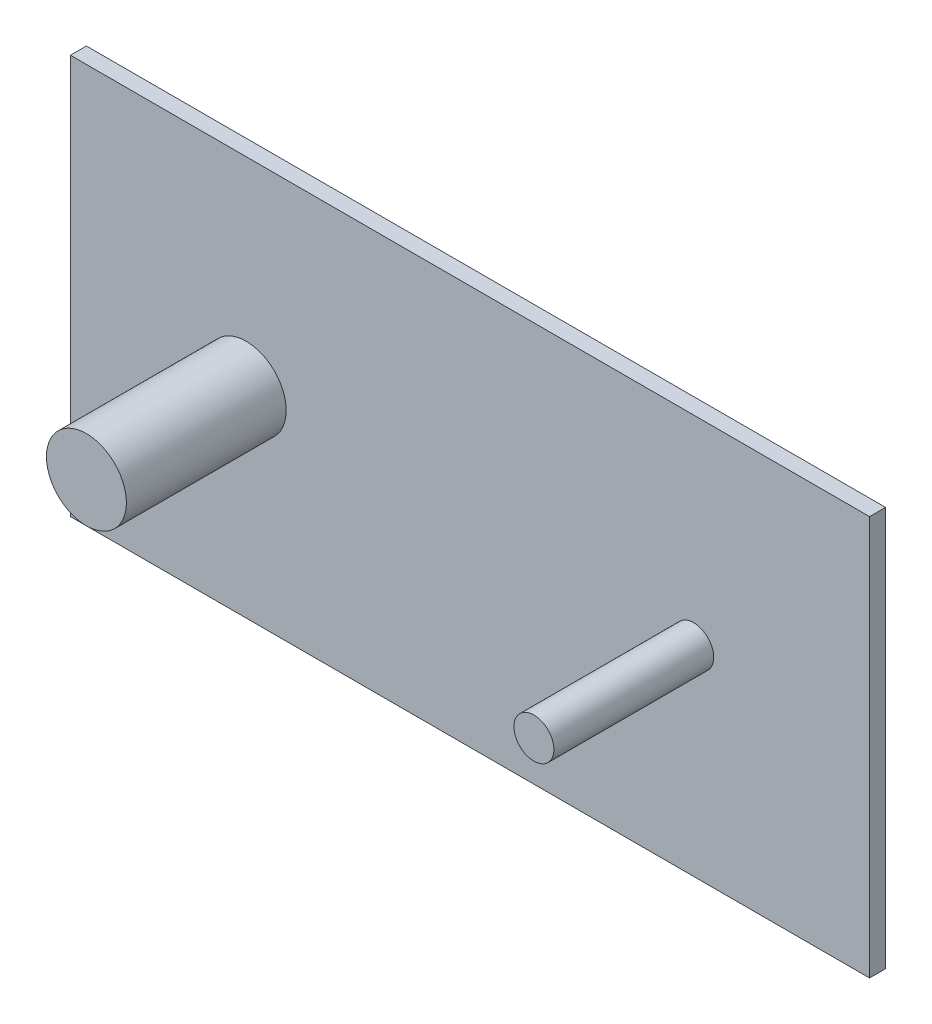
ISO-10303-21;
HEADER;
FILE_DESCRIPTION(('STEP AP214'),'2;1');
FILE_NAME('part.step','',(''),(''),'','','');
FILE_SCHEMA(('AUTOMOTIVE_DESIGN { 1 0 10303 214 1 1 1 1 }'));
ENDSEC;
DATA;
#1=APPLICATION_CONTEXT('core data for automotive mechanical design processes');
#2=APPLICATION_PROTOCOL_DEFINITION('international standard','automotive_design',2000,#1);
#3=PRODUCT_CONTEXT('',#1,'mechanical');
#4=PRODUCT('Part','Part','',(#3));
#5=PRODUCT_RELATED_PRODUCT_CATEGORY('part','',(#4));
#6=PRODUCT_DEFINITION_FORMATION('','',#4);
#7=PRODUCT_DEFINITION_CONTEXT('part definition',#1,'design');
#8=PRODUCT_DEFINITION('design','',#6,#7);
#9=PRODUCT_DEFINITION_SHAPE('','',#8);
#10=(LENGTH_UNIT() NAMED_UNIT(*) SI_UNIT(.MILLI.,.METRE.));
#11=(NAMED_UNIT(*) PLANE_ANGLE_UNIT() SI_UNIT($,.RADIAN.));
#12=(NAMED_UNIT(*) SI_UNIT($,.STERADIAN.) SOLID_ANGLE_UNIT());
#13=UNCERTAINTY_MEASURE_WITH_UNIT(LENGTH_MEASURE(1.E-05),#10,'distance_accuracy_value','');
#14=(GEOMETRIC_REPRESENTATION_CONTEXT(3) GLOBAL_UNCERTAINTY_ASSIGNED_CONTEXT((#13)) GLOBAL_UNIT_ASSIGNED_CONTEXT((#10,
#11,#12)) REPRESENTATION_CONTEXT('',''));
#15=CARTESIAN_POINT('',(0.,0.,0.));
#16=DIRECTION('',(0.,0.,1.));
#17=DIRECTION('',(1.,0.,0.));
#18=AXIS2_PLACEMENT_3D('',#15,#16,#17);
#19=CARTESIAN_POINT('',(250.,-125.,10.));
#20=DIRECTION('',(-1.,0.,0.));
#21=DIRECTION('',(0.,0.,1.));
#22=AXIS2_PLACEMENT_3D('',#19,#20,#21);
#23=PLANE('',#22);
#24=DIRECTION('',(0.,1.,0.));
#25=VECTOR('',#24,1.);
#26=CARTESIAN_POINT('',(250.,-125.,0.));
#27=LINE('',#26,#25);
#28=CARTESIAN_POINT('',(250.,-125.,0.));
#29=VERTEX_POINT('',#28);
#30=CARTESIAN_POINT('',(250.,125.,0.));
#31=VERTEX_POINT('',#30);
#32=EDGE_CURVE('E100',#29,#31,#27,.T.);
#33=ORIENTED_EDGE('',*,*,#32,.T.);
#34=DIRECTION('',(0.,0.,-1.));
#35=VECTOR('',#34,1.);
#36=CARTESIAN_POINT('',(250.,125.,10.));
#37=LINE('',#36,#35);
#38=CARTESIAN_POINT('',(250.,125.,10.));
#39=VERTEX_POINT('',#38);
#40=EDGE_CURVE('E91',#39,#31,#37,.T.);
#41=ORIENTED_EDGE('',*,*,#40,.F.);
#42=DIRECTION('',(0.,1.,0.));
#43=VECTOR('',#42,1.);
#44=CARTESIAN_POINT('',(250.,-125.,10.));
#45=LINE('',#44,#43);
#46=CARTESIAN_POINT('',(250.,-125.,10.));
#47=VERTEX_POINT('',#46);
#48=EDGE_CURVE('E85',#47,#39,#45,.T.);
#49=ORIENTED_EDGE('',*,*,#48,.F.);
#50=DIRECTION('',(0.,0.,-1.));
#51=VECTOR('',#50,1.);
#52=CARTESIAN_POINT('',(250.,-125.,10.));
#53=LINE('',#52,#51);
#54=EDGE_CURVE('E96',#47,#29,#53,.T.);
#55=ORIENTED_EDGE('',*,*,#54,.T.);
#56=EDGE_LOOP('',(#33,#41,#49,#55));
#57=FACE_BOUND('',#56,.T.);
#58=ADVANCED_FACE('F33',(#57),#23,.F.);
#59=CARTESIAN_POINT('',(-250.,125.,10.));
#60=DIRECTION('',(0.,-1.,0.));
#61=DIRECTION('',(0.,0.,-1.));
#62=AXIS2_PLACEMENT_3D('',#59,#60,#61);
#63=PLANE('',#62);
#64=DIRECTION('',(-1.,0.,0.));
#65=VECTOR('',#64,1.);
#66=CARTESIAN_POINT('',(-250.,125.,0.));
#67=LINE('',#66,#65);
#68=CARTESIAN_POINT('',(-250.,125.,0.));
#69=VERTEX_POINT('',#68);
#70=EDGE_CURVE('E90',#31,#69,#67,.T.);
#71=ORIENTED_EDGE('',*,*,#70,.T.);
#72=DIRECTION('',(0.,0.,-1.));
#73=VECTOR('',#72,1.);
#74=CARTESIAN_POINT('',(-250.,125.,10.));
#75=LINE('',#74,#73);
#76=CARTESIAN_POINT('',(-250.,125.,10.));
#77=VERTEX_POINT('',#76);
#78=EDGE_CURVE('E88',#77,#69,#75,.T.);
#79=ORIENTED_EDGE('',*,*,#78,.F.);
#80=DIRECTION('',(-1.,0.,0.));
#81=VECTOR('',#80,1.);
#82=CARTESIAN_POINT('',(-250.,125.,10.));
#83=LINE('',#82,#81);
#84=EDGE_CURVE('E80',#39,#77,#83,.T.);
#85=ORIENTED_EDGE('',*,*,#84,.F.);
#86=ORIENTED_EDGE('',*,*,#40,.T.);
#87=EDGE_LOOP('',(#71,#79,#85,#86));
#88=FACE_BOUND('',#87,.T.);
#89=ADVANCED_FACE('F89',(#88),#63,.F.);
#90=CARTESIAN_POINT('',(-250.,-125.,10.));
#91=DIRECTION('',(1.,0.,0.));
#92=DIRECTION('',(0.,0.,-1.));
#93=AXIS2_PLACEMENT_3D('',#90,#91,#92);
#94=PLANE('',#93);
#95=DIRECTION('',(0.,-1.,0.));
#96=VECTOR('',#95,1.);
#97=CARTESIAN_POINT('',(-250.,-125.,0.));
#98=LINE('',#97,#96);
#99=CARTESIAN_POINT('',(-250.,-125.,0.));
#100=VERTEX_POINT('',#99);
#101=EDGE_CURVE('E66',#69,#100,#98,.T.);
#102=ORIENTED_EDGE('',*,*,#101,.T.);
#103=DIRECTION('',(0.,0.,-1.));
#104=VECTOR('',#103,1.);
#105=CARTESIAN_POINT('',(-250.,-125.,10.));
#106=LINE('',#105,#104);
#107=CARTESIAN_POINT('',(-250.,-125.,10.));
#108=VERTEX_POINT('',#107);
#109=EDGE_CURVE('E92',#108,#100,#106,.T.);
#110=ORIENTED_EDGE('',*,*,#109,.F.);
#111=DIRECTION('',(0.,-1.,0.));
#112=VECTOR('',#111,1.);
#113=CARTESIAN_POINT('',(-250.,-125.,10.));
#114=LINE('',#113,#112);
#115=EDGE_CURVE('E83',#77,#108,#114,.T.);
#116=ORIENTED_EDGE('',*,*,#115,.F.);
#117=ORIENTED_EDGE('',*,*,#78,.T.);
#118=EDGE_LOOP('',(#102,#110,#116,#117));
#119=FACE_BOUND('',#118,.T.);
#120=ADVANCED_FACE('F94',(#119),#94,.F.);
#121=CARTESIAN_POINT('',(-250.,-125.,10.));
#122=DIRECTION('',(0.,1.,0.));
#123=DIRECTION('',(0.,0.,1.));
#124=AXIS2_PLACEMENT_3D('',#121,#122,#123);
#125=PLANE('',#124);
#126=DIRECTION('',(1.,0.,0.));
#127=VECTOR('',#126,1.);
#128=CARTESIAN_POINT('',(-250.,-125.,0.));
#129=LINE('',#128,#127);
#130=EDGE_CURVE('E72',#100,#29,#129,.T.);
#131=ORIENTED_EDGE('',*,*,#130,.T.);
#132=ORIENTED_EDGE('',*,*,#54,.F.);
#133=DIRECTION('',(1.,0.,0.));
#134=VECTOR('',#133,1.);
#135=CARTESIAN_POINT('',(-250.,-125.,10.));
#136=LINE('',#135,#134);
#137=EDGE_CURVE('E49',#108,#47,#136,.T.);
#138=ORIENTED_EDGE('',*,*,#137,.F.);
#139=ORIENTED_EDGE('',*,*,#109,.T.);
#140=EDGE_LOOP('',(#131,#132,#138,#139));
#141=FACE_BOUND('',#140,.T.);
#142=ADVANCED_FACE('F116',(#141),#125,.F.);
#143=CARTESIAN_POINT('',(0.,0.,10.));
#144=DIRECTION('',(0.,0.,-1.));
#145=DIRECTION('',(-1.,0.,0.));
#146=AXIS2_PLACEMENT_3D('',#143,#144,#145);
#147=PLANE('',#146);
#148=CARTESIAN_POINT('',(140.,0.,9.99999999999999));
#149=DIRECTION('',(0.,0.,-1.));
#150=DIRECTION('',(-1.,0.,0.));
#151=AXIS2_PLACEMENT_3D('',#148,#149,#150);
#152=CIRCLE('',#151,12.5);
#153=CARTESIAN_POINT('',(127.5,0.,9.99999999999999));
#154=VERTEX_POINT('',#153);
#155=EDGE_CURVE('E11',#154,#154,#152,.F.);
#156=ORIENTED_EDGE('',*,*,#155,.F.);
#157=EDGE_LOOP('',(#156));
#158=FACE_BOUND('',#157,.T.);
#159=CARTESIAN_POINT('',(-140.,0.,9.99999999999999));
#160=DIRECTION('',(0.,0.,-1.));
#161=DIRECTION('',(-1.,0.,0.));
#162=AXIS2_PLACEMENT_3D('',#159,#160,#161);
#163=CIRCLE('',#162,25.);
#164=CARTESIAN_POINT('',(-165.,0.,9.99999999999999));
#165=VERTEX_POINT('',#164);
#166=EDGE_CURVE('E41',#165,#165,#163,.F.);
#167=ORIENTED_EDGE('',*,*,#166,.F.);
#168=EDGE_LOOP('',(#167));
#169=FACE_BOUND('',#168,.T.);
#170=ORIENTED_EDGE('',*,*,#48,.T.);
#171=ORIENTED_EDGE('',*,*,#84,.T.);
#172=ORIENTED_EDGE('',*,*,#115,.T.);
#173=ORIENTED_EDGE('',*,*,#137,.T.);
#174=EDGE_LOOP('',(#170,#171,#172,#173));
#175=FACE_BOUND('',#174,.T.);
#176=ADVANCED_FACE('F81',(#158,#169,#175),#147,.F.);
#177=CARTESIAN_POINT('',(0.,0.,0.));
#178=DIRECTION('',(0.,0.,-1.));
#179=DIRECTION('',(-1.,0.,0.));
#180=AXIS2_PLACEMENT_3D('',#177,#178,#179);
#181=PLANE('',#180);
#182=ORIENTED_EDGE('',*,*,#32,.F.);
#183=ORIENTED_EDGE('',*,*,#130,.F.);
#184=ORIENTED_EDGE('',*,*,#101,.F.);
#185=ORIENTED_EDGE('',*,*,#70,.F.);
#186=EDGE_LOOP('',(#182,#183,#184,#185));
#187=FACE_BOUND('',#186,.T.);
#188=ADVANCED_FACE('F115',(#187),#181,.T.);
#189=CARTESIAN_POINT('',(-140.,0.,110.));
#190=DIRECTION('',(0.,0.,-1.));
#191=DIRECTION('',(-1.,0.,0.));
#192=AXIS2_PLACEMENT_3D('',#189,#190,#191);
#193=CYLINDRICAL_SURFACE('',#192,25.);
#194=CARTESIAN_POINT('',(-140.,0.,110.));
#195=DIRECTION('',(0.,0.,1.));
#196=DIRECTION('',(1.,0.,0.));
#197=AXIS2_PLACEMENT_3D('',#194,#195,#196);
#198=CIRCLE('',#197,25.);
#199=CARTESIAN_POINT('',(-165.,0.,110.));
#200=VERTEX_POINT('',#199);
#201=EDGE_CURVE('E103',#200,#200,#198,.T.);
#202=CARTESIAN_POINT('',(-165.,0.,110.));
#203=CARTESIAN_POINT('',(-165.,0.,108.958333333333));
#204=CARTESIAN_POINT('',(-165.,0.,107.916666666667));
#205=CARTESIAN_POINT('',(-165.,0.,105.833333333333));
#206=CARTESIAN_POINT('',(-165.,0.,104.791666666667));
#207=CARTESIAN_POINT('',(-165.,0.,102.708333333333));
#208=CARTESIAN_POINT('',(-165.,0.,101.666666666667));
#209=CARTESIAN_POINT('',(-165.,0.,99.5833333333333));
#210=CARTESIAN_POINT('',(-165.,0.,98.5416666666666));
#211=CARTESIAN_POINT('',(-165.,0.,96.4583333333333));
#212=CARTESIAN_POINT('',(-165.,0.,95.4166666666666));
#213=CARTESIAN_POINT('',(-165.,0.,93.3333333333333));
#214=CARTESIAN_POINT('',(-165.,0.,92.2916666666666));
#215=CARTESIAN_POINT('',(-165.,0.,90.2083333333333));
#216=CARTESIAN_POINT('',(-165.,0.,89.1666666666666));
#217=CARTESIAN_POINT('',(-165.,0.,87.0833333333333));
#218=CARTESIAN_POINT('',(-165.,0.,86.0416666666666));
#219=CARTESIAN_POINT('',(-165.,0.,83.9583333333333));
#220=CARTESIAN_POINT('',(-165.,0.,82.9166666666666));
#221=CARTESIAN_POINT('',(-165.,0.,80.8333333333333));
#222=CARTESIAN_POINT('',(-165.,0.,79.7916666666666));
#223=CARTESIAN_POINT('',(-165.,0.,77.7083333333333));
#224=CARTESIAN_POINT('',(-165.,0.,76.6666666666666));
#225=CARTESIAN_POINT('',(-165.,0.,74.5833333333333));
#226=CARTESIAN_POINT('',(-165.,0.,73.5416666666666));
#227=CARTESIAN_POINT('',(-165.,0.,71.4583333333333));
#228=CARTESIAN_POINT('',(-165.,0.,70.4166666666667));
#229=CARTESIAN_POINT('',(-165.,0.,68.3333333333333));
#230=CARTESIAN_POINT('',(-165.,0.,67.2916666666667));
#231=CARTESIAN_POINT('',(-165.,0.,65.2083333333333));
#232=CARTESIAN_POINT('',(-165.,0.,64.1666666666666));
#233=CARTESIAN_POINT('',(-165.,0.,62.0833333333333));
#234=CARTESIAN_POINT('',(-165.,0.,61.0416666666667));
#235=CARTESIAN_POINT('',(-165.,0.,58.9583333333333));
#236=CARTESIAN_POINT('',(-165.,0.,57.9166666666667));
#237=CARTESIAN_POINT('',(-165.,0.,55.8333333333333));
#238=CARTESIAN_POINT('',(-165.,0.,54.7916666666667));
#239=CARTESIAN_POINT('',(-165.,0.,52.7083333333333));
#240=CARTESIAN_POINT('',(-165.,0.,51.6666666666667));
#241=CARTESIAN_POINT('',(-165.,0.,49.5833333333333));
#242=CARTESIAN_POINT('',(-165.,0.,48.5416666666667));
#243=CARTESIAN_POINT('',(-165.,0.,46.4583333333333));
#244=CARTESIAN_POINT('',(-165.,0.,45.4166666666667));
#245=CARTESIAN_POINT('',(-165.,0.,43.3333333333333));
#246=CARTESIAN_POINT('',(-165.,0.,42.2916666666667));
#247=CARTESIAN_POINT('',(-165.,0.,40.2083333333333));
#248=CARTESIAN_POINT('',(-165.,0.,39.1666666666667));
#249=CARTESIAN_POINT('',(-165.,0.,37.0833333333333));
#250=CARTESIAN_POINT('',(-165.,0.,36.0416666666667));
#251=CARTESIAN_POINT('',(-165.,0.,33.9583333333333));
#252=CARTESIAN_POINT('',(-165.,0.,32.9166666666667));
#253=CARTESIAN_POINT('',(-165.,0.,30.8333333333333));
#254=CARTESIAN_POINT('',(-165.,0.,29.7916666666667));
#255=CARTESIAN_POINT('',(-165.,0.,27.7083333333333));
#256=CARTESIAN_POINT('',(-165.,0.,26.6666666666667));
#257=CARTESIAN_POINT('',(-165.,0.,24.5833333333333));
#258=CARTESIAN_POINT('',(-165.,0.,23.5416666666667));
#259=CARTESIAN_POINT('',(-165.,0.,21.4583333333333));
#260=CARTESIAN_POINT('',(-165.,0.,20.4166666666667));
#261=CARTESIAN_POINT('',(-165.,0.,18.3333333333333));
#262=CARTESIAN_POINT('',(-165.,0.,17.2916666666667));
#263=CARTESIAN_POINT('',(-165.,0.,15.2083333333333));
#264=CARTESIAN_POINT('',(-165.,0.,14.1666666666667));
#265=CARTESIAN_POINT('',(-165.,0.,12.0833333333333));
#266=CARTESIAN_POINT('',(-165.,0.,11.0416666666667));
#267=CARTESIAN_POINT('',(-165.,0.,9.99999999999999));
#268=B_SPLINE_CURVE_WITH_KNOTS('',3,(#202,#203,#204,#205,#206,#207,#208,#209,#210,#211,#212,
#213,#214,#215,#216,#217,#218,#219,#220,#221,#222,#223,#224,#225,#226,#227,#228,#229,#230,#231,
#232,#233,#234,#235,#236,#237,#238,#239,#240,#241,#242,#243,#244,#245,#246,#247,#248,#249,#250,
#251,#252,#253,#254,#255,#256,#257,#258,#259,#260,#261,#262,#263,#264,#265,#266,#267),
.UNSPECIFIED.,.F.,.F.,(4,2,2,2,2,2,2,2,2,2,2,2,2,2,2,2,2,2,2,2,2,2,2,2,2,2,2,2,2,2,2,2,4),(0.,
3.125,6.25000000000001,9.37500000000001,12.5,15.625,18.75,21.875,25.,28.125,31.25,34.375,37.5,
40.625,43.75,46.875,50.,53.125,56.25,59.375,62.5,65.625,68.75,71.875,75.,78.125,81.25,84.375,
87.5,90.625,93.75,96.875,100.),.UNSPECIFIED.);
#269=EDGE_CURVE('BSEAM112',#200,#165,#268,.T.);
#270=ORIENTED_EDGE('',*,*,#201,.F.);
#271=ORIENTED_EDGE('',*,*,#166,.T.);
#272=ORIENTED_EDGE('',*,*,#269,.T.);
#273=ORIENTED_EDGE('',*,*,#269,.F.);
#274=EDGE_LOOP('',(#270,#272,#271,#273));
#275=FACE_BOUND('',#274,.T.);
#276=ADVANCED_FACE('F112',(#275),#193,.T.);
#277=CARTESIAN_POINT('',(-140.,0.,110.));
#278=DIRECTION('',(0.,0.,1.));
#279=DIRECTION('',(1.,0.,0.));
#280=AXIS2_PLACEMENT_3D('',#277,#278,#279);
#281=PLANE('',#280);
#282=ORIENTED_EDGE('',*,*,#201,.T.);
#283=EDGE_LOOP('',(#282));
#284=FACE_BOUND('',#283,.T.);
#285=ADVANCED_FACE('F146',(#284),#281,.T.);
#286=CARTESIAN_POINT('',(140.,0.,110.));
#287=DIRECTION('',(0.,0.,-1.));
#288=DIRECTION('',(-1.,0.,0.));
#289=AXIS2_PLACEMENT_3D('',#286,#287,#288);
#290=CYLINDRICAL_SURFACE('',#289,12.5);
#291=CARTESIAN_POINT('',(140.,0.,110.));
#292=DIRECTION('',(0.,0.,1.));
#293=DIRECTION('',(1.,0.,0.));
#294=AXIS2_PLACEMENT_3D('',#291,#292,#293);
#295=CIRCLE('',#294,12.5);
#296=CARTESIAN_POINT('',(127.5,0.,110.));
#297=VERTEX_POINT('',#296);
#298=EDGE_CURVE('E137',#297,#297,#295,.T.);
#299=CARTESIAN_POINT('',(127.5,0.,110.));
#300=CARTESIAN_POINT('',(127.5,0.,108.958333333333));
#301=CARTESIAN_POINT('',(127.5,0.,107.916666666667));
#302=CARTESIAN_POINT('',(127.5,0.,105.833333333333));
#303=CARTESIAN_POINT('',(127.5,0.,104.791666666667));
#304=CARTESIAN_POINT('',(127.5,0.,102.708333333333));
#305=CARTESIAN_POINT('',(127.5,0.,101.666666666667));
#306=CARTESIAN_POINT('',(127.5,0.,99.5833333333333));
#307=CARTESIAN_POINT('',(127.5,0.,98.5416666666666));
#308=CARTESIAN_POINT('',(127.5,0.,96.4583333333333));
#309=CARTESIAN_POINT('',(127.5,0.,95.4166666666666));
#310=CARTESIAN_POINT('',(127.5,0.,93.3333333333333));
#311=CARTESIAN_POINT('',(127.5,0.,92.2916666666666));
#312=CARTESIAN_POINT('',(127.5,0.,90.2083333333333));
#313=CARTESIAN_POINT('',(127.5,0.,89.1666666666666));
#314=CARTESIAN_POINT('',(127.5,0.,87.0833333333333));
#315=CARTESIAN_POINT('',(127.5,0.,86.0416666666667));
#316=CARTESIAN_POINT('',(127.5,0.,83.9583333333333));
#317=CARTESIAN_POINT('',(127.5,0.,82.9166666666667));
#318=CARTESIAN_POINT('',(127.5,0.,80.8333333333333));
#319=CARTESIAN_POINT('',(127.5,0.,79.7916666666666));
#320=CARTESIAN_POINT('',(127.5,0.,77.7083333333333));
#321=CARTESIAN_POINT('',(127.5,0.,76.6666666666667));
#322=CARTESIAN_POINT('',(127.5,0.,74.5833333333333));
#323=CARTESIAN_POINT('',(127.5,0.,73.5416666666667));
#324=CARTESIAN_POINT('',(127.5,0.,71.4583333333333));
#325=CARTESIAN_POINT('',(127.5,0.,70.4166666666667));
#326=CARTESIAN_POINT('',(127.5,0.,68.3333333333333));
#327=CARTESIAN_POINT('',(127.5,0.,67.2916666666667));
#328=CARTESIAN_POINT('',(127.5,0.,65.2083333333333));
#329=CARTESIAN_POINT('',(127.5,0.,64.1666666666666));
#330=CARTESIAN_POINT('',(127.5,0.,62.0833333333333));
#331=CARTESIAN_POINT('',(127.5,0.,61.0416666666667));
#332=CARTESIAN_POINT('',(127.5,0.,58.9583333333333));
#333=CARTESIAN_POINT('',(127.5,0.,57.9166666666667));
#334=CARTESIAN_POINT('',(127.5,0.,55.8333333333333));
#335=CARTESIAN_POINT('',(127.5,0.,54.7916666666667));
#336=CARTESIAN_POINT('',(127.5,0.,52.7083333333333));
#337=CARTESIAN_POINT('',(127.5,0.,51.6666666666667));
#338=CARTESIAN_POINT('',(127.5,0.,49.5833333333333));
#339=CARTESIAN_POINT('',(127.5,0.,48.5416666666667));
#340=CARTESIAN_POINT('',(127.5,0.,46.4583333333333));
#341=CARTESIAN_POINT('',(127.5,0.,45.4166666666667));
#342=CARTESIAN_POINT('',(127.5,0.,43.3333333333333));
#343=CARTESIAN_POINT('',(127.5,0.,42.2916666666667));
#344=CARTESIAN_POINT('',(127.5,0.,40.2083333333333));
#345=CARTESIAN_POINT('',(127.5,0.,39.1666666666667));
#346=CARTESIAN_POINT('',(127.5,0.,37.0833333333333));
#347=CARTESIAN_POINT('',(127.5,0.,36.0416666666667));
#348=CARTESIAN_POINT('',(127.5,0.,33.9583333333333));
#349=CARTESIAN_POINT('',(127.5,0.,32.9166666666667));
#350=CARTESIAN_POINT('',(127.5,0.,30.8333333333333));
#351=CARTESIAN_POINT('',(127.5,0.,29.7916666666667));
#352=CARTESIAN_POINT('',(127.5,0.,27.7083333333333));
#353=CARTESIAN_POINT('',(127.5,0.,26.6666666666667));
#354=CARTESIAN_POINT('',(127.5,0.,24.5833333333333));
#355=CARTESIAN_POINT('',(127.5,0.,23.5416666666667));
#356=CARTESIAN_POINT('',(127.5,0.,21.4583333333333));
#357=CARTESIAN_POINT('',(127.5,0.,20.4166666666667));
#358=CARTESIAN_POINT('',(127.5,0.,18.3333333333333));
#359=CARTESIAN_POINT('',(127.5,0.,17.2916666666667));
#360=CARTESIAN_POINT('',(127.5,0.,15.2083333333333));
#361=CARTESIAN_POINT('',(127.5,0.,14.1666666666667));
#362=CARTESIAN_POINT('',(127.5,0.,12.0833333333333));
#363=CARTESIAN_POINT('',(127.5,0.,11.0416666666667));
#364=CARTESIAN_POINT('',(127.5,0.,9.99999999999999));
#365=B_SPLINE_CURVE_WITH_KNOTS('',3,(#299,#300,#301,#302,#303,#304,#305,#306,#307,#308,#309,
#310,#311,#312,#313,#314,#315,#316,#317,#318,#319,#320,#321,#322,#323,#324,#325,#326,#327,#328,
#329,#330,#331,#332,#333,#334,#335,#336,#337,#338,#339,#340,#341,#342,#343,#344,#345,#346,#347,
#348,#349,#350,#351,#352,#353,#354,#355,#356,#357,#358,#359,#360,#361,#362,#363,#364),
.UNSPECIFIED.,.F.,.F.,(4,2,2,2,2,2,2,2,2,2,2,2,2,2,2,2,2,2,2,2,2,2,2,2,2,2,2,2,2,2,2,2,4),(0.,
3.12499999999999,6.24999999999999,9.37499999999999,12.5,15.625,18.75,21.875,25.,28.125,31.25,
34.375,37.5,40.625,43.75,46.875,50.,53.125,56.25,59.375,62.5,65.625,68.75,71.875,75.,78.125,
81.25,84.375,87.5,90.625,93.75,96.875,100.),.UNSPECIFIED.);
#366=EDGE_CURVE('BSEAM143',#297,#154,#365,.T.);
#367=ORIENTED_EDGE('',*,*,#298,.F.);
#368=ORIENTED_EDGE('',*,*,#155,.T.);
#369=ORIENTED_EDGE('',*,*,#366,.T.);
#370=ORIENTED_EDGE('',*,*,#366,.F.);
#371=EDGE_LOOP('',(#367,#369,#368,#370));
#372=FACE_BOUND('',#371,.T.);
#373=ADVANCED_FACE('F143',(#372),#290,.T.);
#374=CARTESIAN_POINT('',(140.,0.,110.));
#375=DIRECTION('',(0.,0.,1.));
#376=DIRECTION('',(1.,0.,0.));
#377=AXIS2_PLACEMENT_3D('',#374,#375,#376);
#378=PLANE('',#377);
#379=ORIENTED_EDGE('',*,*,#298,.T.);
#380=EDGE_LOOP('',(#379));
#381=FACE_BOUND('',#380,.T.);
#382=ADVANCED_FACE('F141',(#381),#378,.T.);
#383=CLOSED_SHELL('',(#58,#89,#120,#142,#176,#188,#276,#285,#373,#382));
#384=MANIFOLD_SOLID_BREP('B2',#383);
#385=ADVANCED_BREP_SHAPE_REPRESENTATION('',(#18,#384),#14);
#386=SHAPE_DEFINITION_REPRESENTATION(#9,#385);
ENDSEC;
END-ISO-10303-21;
